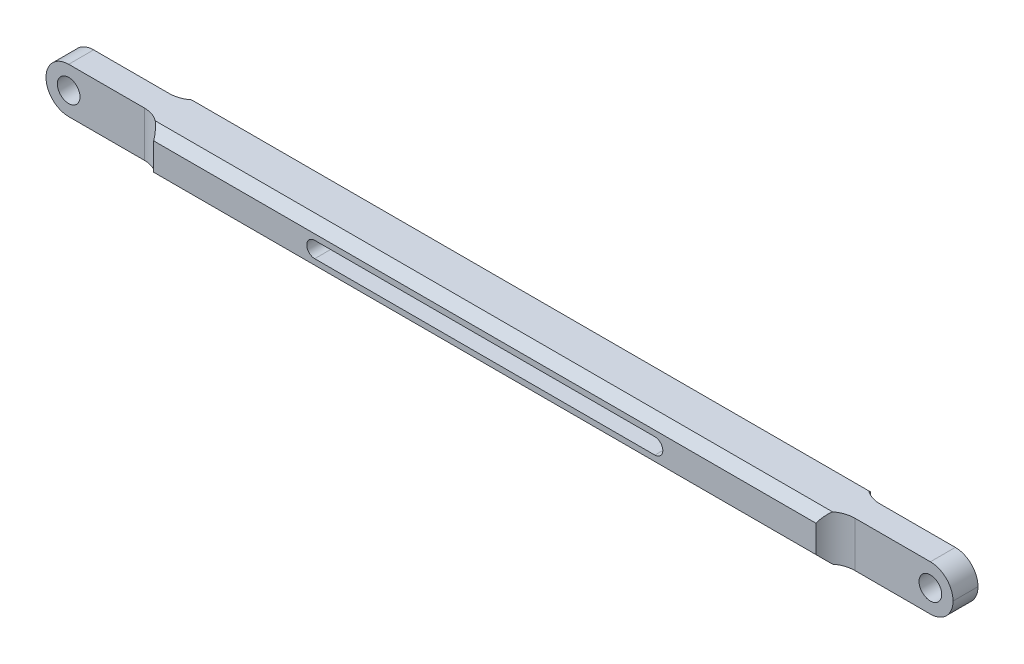
ISO-10303-21;
HEADER;
FILE_DESCRIPTION(('STEP AP214'),'2;1');
FILE_NAME('part.step','',(''),(''),'','','');
FILE_SCHEMA(('AUTOMOTIVE_DESIGN { 1 0 10303 214 1 1 1 1 }'));
ENDSEC;
DATA;
#1=APPLICATION_CONTEXT('core data for automotive mechanical design processes');
#2=APPLICATION_PROTOCOL_DEFINITION('international standard','automotive_design',2000,#1);
#3=PRODUCT_CONTEXT('',#1,'mechanical');
#4=PRODUCT('Part','Part','',(#3));
#5=PRODUCT_RELATED_PRODUCT_CATEGORY('part','',(#4));
#6=PRODUCT_DEFINITION_FORMATION('','',#4);
#7=PRODUCT_DEFINITION_CONTEXT('part definition',#1,'design');
#8=PRODUCT_DEFINITION('design','',#6,#7);
#9=PRODUCT_DEFINITION_SHAPE('','',#8);
#10=(LENGTH_UNIT() NAMED_UNIT(*) SI_UNIT(.MILLI.,.METRE.));
#11=(NAMED_UNIT(*) PLANE_ANGLE_UNIT() SI_UNIT($,.RADIAN.));
#12=(NAMED_UNIT(*) SI_UNIT($,.STERADIAN.) SOLID_ANGLE_UNIT());
#13=UNCERTAINTY_MEASURE_WITH_UNIT(LENGTH_MEASURE(1.E-05),#10,'distance_accuracy_value','');
#14=(GEOMETRIC_REPRESENTATION_CONTEXT(3) GLOBAL_UNCERTAINTY_ASSIGNED_CONTEXT((#13)) GLOBAL_UNIT_ASSIGNED_CONTEXT((#10,
#11,#12)) REPRESENTATION_CONTEXT('',''));
#15=CARTESIAN_POINT('',(0.,0.,0.));
#16=DIRECTION('',(0.,0.,1.));
#17=DIRECTION('',(1.,0.,0.));
#18=AXIS2_PLACEMENT_3D('',#15,#16,#17);
#19=CARTESIAN_POINT('',(-100.,5.,6.));
#20=DIRECTION('',(0.,-1.,0.));
#21=DIRECTION('',(0.,0.,-1.));
#22=AXIS2_PLACEMENT_3D('',#19,#20,#21);
#23=PLANE('',#22);
#24=CARTESIAN_POINT('',(-78.3326822519254,5.,8.75));
#25=DIRECTION('',(0.,-1.,0.));
#26=DIRECTION('',(0.,0.,-1.));
#27=AXIS2_PLACEMENT_3D('',#24,#25,#26);
#28=CIRCLE('',#27,6.);
#29=CARTESIAN_POINT('',(-78.3326822519254,5.,2.75));
#30=VERTEX_POINT('',#29);
#31=CARTESIAN_POINT('',(-74.6669626772716,5.,4.));
#32=VERTEX_POINT('',#31);
#33=EDGE_CURVE('E283',#30,#32,#28,.T.);
#34=ORIENTED_EDGE('',*,*,#33,.T.);
#35=DIRECTION('',(1.,0.,0.));
#36=VECTOR('',#35,1.);
#37=CARTESIAN_POINT('',(73.,5.,4.));
#38=LINE('',#37,#36);
#39=CARTESIAN_POINT('',(74.6669626772716,5.,4.));
#40=VERTEX_POINT('',#39);
#41=EDGE_CURVE('E331',#32,#40,#38,.T.);
#42=ORIENTED_EDGE('',*,*,#41,.T.);
#43=CARTESIAN_POINT('',(78.3326822519254,5.,8.75));
#44=DIRECTION('',(0.,-1.,0.));
#45=DIRECTION('',(0.,0.,-1.));
#46=AXIS2_PLACEMENT_3D('',#43,#44,#45);
#47=CIRCLE('',#46,6.);
#48=CARTESIAN_POINT('',(78.3326822519254,5.,2.75));
#49=VERTEX_POINT('',#48);
#50=EDGE_CURVE('E273',#40,#49,#47,.T.);
#51=ORIENTED_EDGE('',*,*,#50,.T.);
#52=DIRECTION('',(1.,0.,0.));
#53=VECTOR('',#52,1.);
#54=CARTESIAN_POINT('',(-100.,5.,2.75));
#55=LINE('',#54,#53);
#56=CARTESIAN_POINT('',(95.,5.,2.75));
#57=VERTEX_POINT('',#56);
#58=EDGE_CURVE('E225',#49,#57,#55,.T.);
#59=ORIENTED_EDGE('',*,*,#58,.T.);
#60=DIRECTION('',(0.,0.,-1.));
#61=VECTOR('',#60,1.);
#62=CARTESIAN_POINT('',(95.,5.,6.));
#63=LINE('',#62,#61);
#64=CARTESIAN_POINT('',(95.,5.,-2.75));
#65=VERTEX_POINT('',#64);
#66=EDGE_CURVE('E302',#57,#65,#63,.T.);
#67=ORIENTED_EDGE('',*,*,#66,.T.);
#68=DIRECTION('',(-1.,0.,0.));
#69=VECTOR('',#68,1.);
#70=CARTESIAN_POINT('',(-100.,5.,-2.75));
#71=LINE('',#70,#69);
#72=CARTESIAN_POINT('',(78.3326822519254,5.,-2.75));
#73=VERTEX_POINT('',#72);
#74=EDGE_CURVE('E223',#65,#73,#71,.T.);
#75=ORIENTED_EDGE('',*,*,#74,.T.);
#76=CARTESIAN_POINT('',(78.3326822519254,5.,-8.75));
#77=DIRECTION('',(0.,-1.,0.));
#78=DIRECTION('',(0.,0.,-1.));
#79=AXIS2_PLACEMENT_3D('',#76,#77,#78);
#80=CIRCLE('',#79,6.);
#81=CARTESIAN_POINT('',(74.6669626772716,5.,-4.));
#82=VERTEX_POINT('',#81);
#83=EDGE_CURVE('E268',#73,#82,#80,.T.);
#84=ORIENTED_EDGE('',*,*,#83,.T.);
#85=DIRECTION('',(-1.,0.,0.));
#86=VECTOR('',#85,1.);
#87=CARTESIAN_POINT('',(-100.,5.,-4.));
#88=LINE('',#87,#86);
#89=CARTESIAN_POINT('',(-74.6669626772716,5.,-4.));
#90=VERTEX_POINT('',#89);
#91=EDGE_CURVE('E328',#82,#90,#88,.T.);
#92=ORIENTED_EDGE('',*,*,#91,.T.);
#93=CARTESIAN_POINT('',(-78.3326822519254,5.,-8.75));
#94=DIRECTION('',(0.,-1.,0.));
#95=DIRECTION('',(0.,0.,-1.));
#96=AXIS2_PLACEMENT_3D('',#93,#94,#95);
#97=CIRCLE('',#96,6.);
#98=CARTESIAN_POINT('',(-78.3326822519254,5.,-2.75));
#99=VERTEX_POINT('',#98);
#100=EDGE_CURVE('E278',#90,#99,#97,.T.);
#101=ORIENTED_EDGE('',*,*,#100,.T.);
#102=DIRECTION('',(-1.,0.,0.));
#103=VECTOR('',#102,1.);
#104=CARTESIAN_POINT('',(-100.,5.,-2.75));
#105=LINE('',#104,#103);
#106=CARTESIAN_POINT('',(-95.,5.,-2.75));
#107=VERTEX_POINT('',#106);
#108=EDGE_CURVE('E231',#99,#107,#105,.T.);
#109=ORIENTED_EDGE('',*,*,#108,.T.);
#110=DIRECTION('',(0.,0.,-1.));
#111=VECTOR('',#110,1.);
#112=CARTESIAN_POINT('',(-95.,5.,6.));
#113=LINE('',#112,#111);
#114=CARTESIAN_POINT('',(-95.,5.,2.75));
#115=VERTEX_POINT('',#114);
#116=EDGE_CURVE('E304',#107,#115,#113,.F.);
#117=ORIENTED_EDGE('',*,*,#116,.T.);
#118=DIRECTION('',(1.,0.,0.));
#119=VECTOR('',#118,1.);
#120=CARTESIAN_POINT('',(-100.,5.,2.75));
#121=LINE('',#120,#119);
#122=EDGE_CURVE('E229',#115,#30,#121,.T.);
#123=ORIENTED_EDGE('',*,*,#122,.T.);
#124=EDGE_LOOP('',(#34,#42,#51,#59,#67,#75,#84,#92,#101,#109,#117,#123));
#125=FACE_BOUND('',#124,.T.);
#126=ADVANCED_FACE('F37',(#125),#23,.F.);
#127=CARTESIAN_POINT('',(-100.,-5.,6.));
#128=DIRECTION('',(0.,1.,0.));
#129=DIRECTION('',(0.,0.,1.));
#130=AXIS2_PLACEMENT_3D('',#127,#128,#129);
#131=PLANE('',#130);
#132=CARTESIAN_POINT('',(78.3326822519254,-5.,8.75));
#133=DIRECTION('',(0.,1.,0.));
#134=DIRECTION('',(0.,0.,1.));
#135=AXIS2_PLACEMENT_3D('',#132,#133,#134);
#136=CIRCLE('',#135,6.);
#137=CARTESIAN_POINT('',(78.3326822519254,-5.,2.75));
#138=VERTEX_POINT('',#137);
#139=CARTESIAN_POINT('',(74.6669626772716,-5.,4.));
#140=VERTEX_POINT('',#139);
#141=EDGE_CURVE('E275',#138,#140,#136,.T.);
#142=ORIENTED_EDGE('',*,*,#141,.T.);
#143=DIRECTION('',(-1.,0.,0.));
#144=VECTOR('',#143,1.);
#145=CARTESIAN_POINT('',(-73.,-5.,4.));
#146=LINE('',#145,#144);
#147=CARTESIAN_POINT('',(-74.6669626772716,-5.,4.));
#148=VERTEX_POINT('',#147);
#149=EDGE_CURVE('E340',#140,#148,#146,.T.);
#150=ORIENTED_EDGE('',*,*,#149,.T.);
#151=CARTESIAN_POINT('',(-78.3326822519254,-5.,8.75));
#152=DIRECTION('',(0.,1.,0.));
#153=DIRECTION('',(0.,0.,1.));
#154=AXIS2_PLACEMENT_3D('',#151,#152,#153);
#155=CIRCLE('',#154,6.);
#156=CARTESIAN_POINT('',(-78.3326822519254,-5.,2.75));
#157=VERTEX_POINT('',#156);
#158=EDGE_CURVE('E286',#148,#157,#155,.T.);
#159=ORIENTED_EDGE('',*,*,#158,.T.);
#160=DIRECTION('',(-1.,0.,0.));
#161=VECTOR('',#160,1.);
#162=CARTESIAN_POINT('',(-100.,-5.,2.75));
#163=LINE('',#162,#161);
#164=CARTESIAN_POINT('',(-95.,-5.,2.75));
#165=VERTEX_POINT('',#164);
#166=EDGE_CURVE('E251',#157,#165,#163,.T.);
#167=ORIENTED_EDGE('',*,*,#166,.T.);
#168=DIRECTION('',(0.,0.,-1.));
#169=VECTOR('',#168,1.);
#170=CARTESIAN_POINT('',(-95.,-5.,6.));
#171=LINE('',#170,#169);
#172=CARTESIAN_POINT('',(-95.,-5.,-2.75));
#173=VERTEX_POINT('',#172);
#174=EDGE_CURVE('E291',#165,#173,#171,.T.);
#175=ORIENTED_EDGE('',*,*,#174,.T.);
#176=DIRECTION('',(1.,0.,0.));
#177=VECTOR('',#176,1.);
#178=CARTESIAN_POINT('',(-100.,-5.,-2.75));
#179=LINE('',#178,#177);
#180=CARTESIAN_POINT('',(-78.3326822519254,-5.,-2.75));
#181=VERTEX_POINT('',#180);
#182=EDGE_CURVE('E254',#173,#181,#179,.T.);
#183=ORIENTED_EDGE('',*,*,#182,.T.);
#184=CARTESIAN_POINT('',(-78.3326822519254,-5.,-8.75));
#185=DIRECTION('',(0.,1.,0.));
#186=DIRECTION('',(0.,0.,1.));
#187=AXIS2_PLACEMENT_3D('',#184,#185,#186);
#188=CIRCLE('',#187,6.);
#189=CARTESIAN_POINT('',(-74.6669626772716,-5.,-4.));
#190=VERTEX_POINT('',#189);
#191=EDGE_CURVE('E280',#181,#190,#188,.T.);
#192=ORIENTED_EDGE('',*,*,#191,.T.);
#193=DIRECTION('',(1.,0.,0.));
#194=VECTOR('',#193,1.);
#195=CARTESIAN_POINT('',(-100.,-5.,-4.));
#196=LINE('',#195,#194);
#197=CARTESIAN_POINT('',(74.6669626772716,-5.,-4.));
#198=VERTEX_POINT('',#197);
#199=EDGE_CURVE('E337',#190,#198,#196,.T.);
#200=ORIENTED_EDGE('',*,*,#199,.T.);
#201=CARTESIAN_POINT('',(78.3326822519254,-5.,-8.75));
#202=DIRECTION('',(0.,1.,0.));
#203=DIRECTION('',(0.,0.,1.));
#204=AXIS2_PLACEMENT_3D('',#201,#202,#203);
#205=CIRCLE('',#204,6.);
#206=CARTESIAN_POINT('',(78.3326822519254,-5.,-2.75));
#207=VERTEX_POINT('',#206);
#208=EDGE_CURVE('E271',#198,#207,#205,.T.);
#209=ORIENTED_EDGE('',*,*,#208,.T.);
#210=DIRECTION('',(1.,0.,0.));
#211=VECTOR('',#210,1.);
#212=CARTESIAN_POINT('',(-100.,-5.,-2.75));
#213=LINE('',#212,#211);
#214=CARTESIAN_POINT('',(95.,-5.,-2.75));
#215=VERTEX_POINT('',#214);
#216=EDGE_CURVE('E246',#207,#215,#213,.T.);
#217=ORIENTED_EDGE('',*,*,#216,.T.);
#218=DIRECTION('',(0.,0.,-1.));
#219=VECTOR('',#218,1.);
#220=CARTESIAN_POINT('',(95.,-5.,6.));
#221=LINE('',#220,#219);
#222=CARTESIAN_POINT('',(95.,-5.,2.75));
#223=VERTEX_POINT('',#222);
#224=EDGE_CURVE('E288',#215,#223,#221,.F.);
#225=ORIENTED_EDGE('',*,*,#224,.T.);
#226=DIRECTION('',(-1.,0.,0.));
#227=VECTOR('',#226,1.);
#228=CARTESIAN_POINT('',(-100.,-5.,2.75));
#229=LINE('',#228,#227);
#230=EDGE_CURVE('E249',#223,#138,#229,.T.);
#231=ORIENTED_EDGE('',*,*,#230,.T.);
#232=EDGE_LOOP('',(#142,#150,#159,#167,#175,#183,#192,#200,#209,#217,#225,#231));
#233=FACE_BOUND('',#232,.T.);
#234=ADVANCED_FACE('F387',(#233),#131,.F.);
#235=CARTESIAN_POINT('',(0.,0.,6.));
#236=DIRECTION('',(0.,0.,1.));
#237=DIRECTION('',(1.,0.,0.));
#238=AXIS2_PLACEMENT_3D('',#235,#236,#237);
#239=PLANE('',#238);
#240=CARTESIAN_POINT('',(37.5,0.,6.));
#241=DIRECTION('',(0.,0.,1.));
#242=DIRECTION('',(1.,0.,0.));
#243=AXIS2_PLACEMENT_3D('',#240,#241,#242);
#244=CIRCLE('',#243,1.75);
#245=CARTESIAN_POINT('',(37.5,-1.75,6.));
#246=VERTEX_POINT('',#245);
#247=CARTESIAN_POINT('',(37.5,1.75,6.));
#248=VERTEX_POINT('',#247);
#249=EDGE_CURVE('E220',#246,#248,#244,.T.);
#250=ORIENTED_EDGE('',*,*,#249,.F.);
#251=DIRECTION('',(1.,0.,0.));
#252=VECTOR('',#251,1.);
#253=CARTESIAN_POINT('',(0.,-1.74999999999999,6.));
#254=LINE('',#253,#252);
#255=CARTESIAN_POINT('',(-37.5,-1.74999999999999,6.));
#256=VERTEX_POINT('',#255);
#257=EDGE_CURVE('E213',#256,#246,#254,.T.);
#258=ORIENTED_EDGE('',*,*,#257,.F.);
#259=CARTESIAN_POINT('',(-37.5,0.,6.));
#260=DIRECTION('',(0.,0.,1.));
#261=DIRECTION('',(1.,0.,0.));
#262=AXIS2_PLACEMENT_3D('',#259,#260,#261);
#263=CIRCLE('',#262,1.75);
#264=CARTESIAN_POINT('',(-37.5,1.75000000000001,6.));
#265=VERTEX_POINT('',#264);
#266=EDGE_CURVE('E193',#265,#256,#263,.T.);
#267=ORIENTED_EDGE('',*,*,#266,.F.);
#268=DIRECTION('',(-1.,0.,0.));
#269=VECTOR('',#268,1.);
#270=CARTESIAN_POINT('',(0.,1.75000000000001,6.));
#271=LINE('',#270,#269);
#272=EDGE_CURVE('E218',#248,#265,#271,.T.);
#273=ORIENTED_EDGE('',*,*,#272,.F.);
#274=EDGE_LOOP('',(#250,#258,#267,#273));
#275=FACE_BOUND('',#274,.T.);
#276=DIRECTION('',(0.,-1.,0.));
#277=VECTOR('',#276,1.);
#278=CARTESIAN_POINT('',(73.,0.,6.));
#279=LINE('',#278,#277);
#280=CARTESIAN_POINT('',(73.,3.,6.));
#281=VERTEX_POINT('',#280);
#282=CARTESIAN_POINT('',(73.,-3.,6.));
#283=VERTEX_POINT('',#282);
#284=EDGE_CURVE('E240',#281,#283,#279,.T.);
#285=ORIENTED_EDGE('',*,*,#284,.F.);
#286=DIRECTION('',(-1.,0.,0.));
#287=VECTOR('',#286,1.);
#288=CARTESIAN_POINT('',(-73.,3.,6.));
#289=LINE('',#288,#287);
#290=CARTESIAN_POINT('',(-73.,3.,6.));
#291=VERTEX_POINT('',#290);
#292=EDGE_CURVE('E321',#281,#291,#289,.T.);
#293=ORIENTED_EDGE('',*,*,#292,.T.);
#294=DIRECTION('',(0.,1.,0.));
#295=VECTOR('',#294,1.);
#296=CARTESIAN_POINT('',(-73.,0.,6.));
#297=LINE('',#296,#295);
#298=CARTESIAN_POINT('',(-73.,-3.,6.));
#299=VERTEX_POINT('',#298);
#300=EDGE_CURVE('E243',#299,#291,#297,.T.);
#301=ORIENTED_EDGE('',*,*,#300,.F.);
#302=DIRECTION('',(1.,0.,0.));
#303=VECTOR('',#302,1.);
#304=CARTESIAN_POINT('',(73.,-3.,6.));
#305=LINE('',#304,#303);
#306=EDGE_CURVE('E314',#299,#283,#305,.T.);
#307=ORIENTED_EDGE('',*,*,#306,.T.);
#308=EDGE_LOOP('',(#285,#293,#301,#307));
#309=FACE_BOUND('',#308,.T.);
#310=ADVANCED_FACE('F408',(#275,#309),#239,.T.);
#311=CARTESIAN_POINT('',(0.,0.,-6.));
#312=DIRECTION('',(0.,0.,1.));
#313=DIRECTION('',(1.,0.,0.));
#314=AXIS2_PLACEMENT_3D('',#311,#312,#313);
#315=PLANE('',#314);
#316=DIRECTION('',(-1.,0.,0.));
#317=VECTOR('',#316,1.);
#318=CARTESIAN_POINT('',(37.5,-1.75,-6.));
#319=LINE('',#318,#317);
#320=CARTESIAN_POINT('',(37.5,-1.75,-6.));
#321=VERTEX_POINT('',#320);
#322=CARTESIAN_POINT('',(-37.5,-1.74999999999999,-6.));
#323=VERTEX_POINT('',#322);
#324=EDGE_CURVE('E199',#321,#323,#319,.T.);
#325=ORIENTED_EDGE('',*,*,#324,.F.);
#326=CARTESIAN_POINT('',(37.5,0.,-6.));
#327=DIRECTION('',(0.,0.,-1.));
#328=DIRECTION('',(-1.,0.,0.));
#329=AXIS2_PLACEMENT_3D('',#326,#327,#328);
#330=CIRCLE('',#329,1.75);
#331=CARTESIAN_POINT('',(37.5,1.75,-6.));
#332=VERTEX_POINT('',#331);
#333=EDGE_CURVE('E62',#332,#321,#330,.T.);
#334=ORIENTED_EDGE('',*,*,#333,.F.);
#335=DIRECTION('',(1.,0.,0.));
#336=VECTOR('',#335,1.);
#337=CARTESIAN_POINT('',(37.5,1.75,-6.));
#338=LINE('',#337,#336);
#339=CARTESIAN_POINT('',(-37.5,1.75000000000001,-6.));
#340=VERTEX_POINT('',#339);
#341=EDGE_CURVE('E206',#340,#332,#338,.T.);
#342=ORIENTED_EDGE('',*,*,#341,.F.);
#343=CARTESIAN_POINT('',(-37.5,0.,-6.));
#344=DIRECTION('',(0.,0.,-1.));
#345=DIRECTION('',(-1.,0.,0.));
#346=AXIS2_PLACEMENT_3D('',#343,#344,#345);
#347=CIRCLE('',#346,1.75);
#348=EDGE_CURVE('E190',#323,#340,#347,.T.);
#349=ORIENTED_EDGE('',*,*,#348,.F.);
#350=EDGE_LOOP('',(#325,#334,#342,#349));
#351=FACE_BOUND('',#350,.T.);
#352=DIRECTION('',(0.,1.,0.));
#353=VECTOR('',#352,1.);
#354=CARTESIAN_POINT('',(-73.,0.,-6.));
#355=LINE('',#354,#353);
#356=CARTESIAN_POINT('',(-73.,-3.,-6.));
#357=VERTEX_POINT('',#356);
#358=CARTESIAN_POINT('',(-73.,3.,-6.));
#359=VERTEX_POINT('',#358);
#360=EDGE_CURVE('E237',#357,#359,#355,.T.);
#361=ORIENTED_EDGE('',*,*,#360,.T.);
#362=DIRECTION('',(1.,0.,0.));
#363=VECTOR('',#362,1.);
#364=CARTESIAN_POINT('',(0.,3.,-6.));
#365=LINE('',#364,#363);
#366=CARTESIAN_POINT('',(73.,3.,-6.));
#367=VERTEX_POINT('',#366);
#368=EDGE_CURVE('E348',#359,#367,#365,.T.);
#369=ORIENTED_EDGE('',*,*,#368,.T.);
#370=DIRECTION('',(0.,-1.,0.));
#371=VECTOR('',#370,1.);
#372=CARTESIAN_POINT('',(73.,0.,-6.));
#373=LINE('',#372,#371);
#374=CARTESIAN_POINT('',(73.,-3.,-6.));
#375=VERTEX_POINT('',#374);
#376=EDGE_CURVE('E234',#367,#375,#373,.T.);
#377=ORIENTED_EDGE('',*,*,#376,.T.);
#378=DIRECTION('',(-1.,0.,0.));
#379=VECTOR('',#378,1.);
#380=CARTESIAN_POINT('',(0.,-3.,-6.));
#381=LINE('',#380,#379);
#382=EDGE_CURVE('E346',#375,#357,#381,.T.);
#383=ORIENTED_EDGE('',*,*,#382,.T.);
#384=EDGE_LOOP('',(#361,#369,#377,#383));
#385=FACE_BOUND('',#384,.T.);
#386=ADVANCED_FACE('F203',(#351,#385),#315,.F.);
#387=CARTESIAN_POINT('',(127.,-15.5,-2.75));
#388=DIRECTION('',(0.,0.,1.));
#389=DIRECTION('',(1.,0.,0.));
#390=AXIS2_PLACEMENT_3D('',#387,#388,#389);
#391=PLANE('',#390);
#392=CARTESIAN_POINT('',(95.,0.,-2.75));
#393=DIRECTION('',(0.,0.,-1.));
#394=DIRECTION('',(-1.,0.,0.));
#395=AXIS2_PLACEMENT_3D('',#392,#393,#394);
#396=CIRCLE('',#395,2.50000000000001);
#397=CARTESIAN_POINT('',(92.5,0.,-2.75));
#398=VERTEX_POINT('',#397);
#399=EDGE_CURVE('E357',#398,#398,#396,.T.);
#400=ORIENTED_EDGE('',*,*,#399,.F.);
#401=EDGE_LOOP('',(#400));
#402=FACE_BOUND('',#401,.T.);
#403=CARTESIAN_POINT('',(95.,0.,-2.75));
#404=DIRECTION('',(0.,0.,1.));
#405=DIRECTION('',(1.,0.,0.));
#406=AXIS2_PLACEMENT_3D('',#403,#404,#405);
#407=CIRCLE('',#406,5.);
#408=CARTESIAN_POINT('',(100.,0.,-2.75));
#409=VERTEX_POINT('',#408);
#410=EDGE_CURVE('E306',#65,#409,#407,.F.);
#411=ORIENTED_EDGE('',*,*,#410,.T.);
#412=CARTESIAN_POINT('',(95.,0.,-2.75));
#413=DIRECTION('',(0.,0.,1.));
#414=DIRECTION('',(1.,0.,0.));
#415=AXIS2_PLACEMENT_3D('',#412,#413,#414);
#416=CIRCLE('',#415,5.);
#417=EDGE_CURVE('E308',#409,#215,#416,.F.);
#418=ORIENTED_EDGE('',*,*,#417,.T.);
#419=ORIENTED_EDGE('',*,*,#216,.F.);
#420=DIRECTION('',(0.,1.,0.));
#421=VECTOR('',#420,1.);
#422=CARTESIAN_POINT('',(78.3326822519254,-15.5,-2.75));
#423=LINE('',#422,#421);
#424=EDGE_CURVE('E256',#207,#73,#423,.T.);
#425=ORIENTED_EDGE('',*,*,#424,.T.);
#426=ORIENTED_EDGE('',*,*,#74,.F.);
#427=EDGE_LOOP('',(#411,#418,#419,#425,#426));
#428=FACE_BOUND('',#427,.T.);
#429=ADVANCED_FACE('F368',(#402,#428),#391,.F.);
#430=CARTESIAN_POINT('',(-127.,-15.5,-2.75));
#431=DIRECTION('',(0.,0.,1.));
#432=DIRECTION('',(1.,0.,0.));
#433=AXIS2_PLACEMENT_3D('',#430,#431,#432);
#434=PLANE('',#433);
#435=CARTESIAN_POINT('',(-95.,0.,-2.75));
#436=DIRECTION('',(0.,0.,-1.));
#437=DIRECTION('',(-1.,0.,0.));
#438=AXIS2_PLACEMENT_3D('',#435,#436,#437);
#439=CIRCLE('',#438,2.5);
#440=CARTESIAN_POINT('',(-97.5,0.,-2.75));
#441=VERTEX_POINT('',#440);
#442=EDGE_CURVE('E352',#441,#441,#439,.T.);
#443=ORIENTED_EDGE('',*,*,#442,.F.);
#444=EDGE_LOOP('',(#443));
#445=FACE_BOUND('',#444,.T.);
#446=ORIENTED_EDGE('',*,*,#182,.F.);
#447=CARTESIAN_POINT('',(-95.,0.,-2.75));
#448=DIRECTION('',(0.,0.,1.));
#449=DIRECTION('',(1.,0.,0.));
#450=AXIS2_PLACEMENT_3D('',#447,#448,#449);
#451=CIRCLE('',#450,5.);
#452=CARTESIAN_POINT('',(-100.,0.,-2.75));
#453=VERTEX_POINT('',#452);
#454=EDGE_CURVE('E296',#173,#453,#451,.F.);
#455=ORIENTED_EDGE('',*,*,#454,.T.);
#456=CARTESIAN_POINT('',(-95.,0.,-2.75));
#457=DIRECTION('',(0.,0.,1.));
#458=DIRECTION('',(1.,0.,0.));
#459=AXIS2_PLACEMENT_3D('',#456,#457,#458);
#460=CIRCLE('',#459,5.);
#461=EDGE_CURVE('E294',#453,#107,#460,.F.);
#462=ORIENTED_EDGE('',*,*,#461,.T.);
#463=ORIENTED_EDGE('',*,*,#108,.F.);
#464=DIRECTION('',(0.,-1.,0.));
#465=VECTOR('',#464,1.);
#466=CARTESIAN_POINT('',(-78.3326822519254,-15.5,-2.75));
#467=LINE('',#466,#465);
#468=EDGE_CURVE('E262',#99,#181,#467,.T.);
#469=ORIENTED_EDGE('',*,*,#468,.T.);
#470=EDGE_LOOP('',(#446,#455,#462,#463,#469));
#471=FACE_BOUND('',#470,.T.);
#472=ADVANCED_FACE('F371',(#445,#471),#434,.F.);
#473=CARTESIAN_POINT('',(127.,-15.5,2.75));
#474=DIRECTION('',(0.,0.,-1.));
#475=DIRECTION('',(-1.,0.,0.));
#476=AXIS2_PLACEMENT_3D('',#473,#474,#475);
#477=PLANE('',#476);
#478=CARTESIAN_POINT('',(95.,0.,2.75));
#479=DIRECTION('',(0.,0.,-1.));
#480=DIRECTION('',(-1.,0.,0.));
#481=AXIS2_PLACEMENT_3D('',#478,#479,#480);
#482=CIRCLE('',#481,2.50000000000001);
#483=CARTESIAN_POINT('',(92.5,0.,2.75));
#484=VERTEX_POINT('',#483);
#485=EDGE_CURVE('E41',#484,#484,#482,.T.);
#486=ORIENTED_EDGE('',*,*,#485,.T.);
#487=EDGE_LOOP('',(#486));
#488=FACE_BOUND('',#487,.T.);
#489=ORIENTED_EDGE('',*,*,#230,.F.);
#490=CARTESIAN_POINT('',(95.,0.,2.75));
#491=DIRECTION('',(0.,0.,-1.));
#492=DIRECTION('',(-1.,0.,0.));
#493=AXIS2_PLACEMENT_3D('',#490,#491,#492);
#494=CIRCLE('',#493,5.);
#495=CARTESIAN_POINT('',(100.,0.,2.75));
#496=VERTEX_POINT('',#495);
#497=EDGE_CURVE('E312',#223,#496,#494,.F.);
#498=ORIENTED_EDGE('',*,*,#497,.T.);
#499=CARTESIAN_POINT('',(95.,0.,2.75));
#500=DIRECTION('',(0.,0.,-1.));
#501=DIRECTION('',(-1.,0.,0.));
#502=AXIS2_PLACEMENT_3D('',#499,#500,#501);
#503=CIRCLE('',#502,5.);
#504=EDGE_CURVE('E310',#496,#57,#503,.F.);
#505=ORIENTED_EDGE('',*,*,#504,.T.);
#506=ORIENTED_EDGE('',*,*,#58,.F.);
#507=DIRECTION('',(0.,1.,0.));
#508=VECTOR('',#507,1.);
#509=CARTESIAN_POINT('',(78.3326822519254,-15.5,2.75));
#510=LINE('',#509,#508);
#511=EDGE_CURVE('E259',#49,#138,#510,.F.);
#512=ORIENTED_EDGE('',*,*,#511,.T.);
#513=EDGE_LOOP('',(#489,#498,#505,#506,#512));
#514=FACE_BOUND('',#513,.T.);
#515=ADVANCED_FACE('F389',(#488,#514),#477,.F.);
#516=CARTESIAN_POINT('',(-127.,-15.5,2.75));
#517=DIRECTION('',(0.,0.,-1.));
#518=DIRECTION('',(-1.,0.,0.));
#519=AXIS2_PLACEMENT_3D('',#516,#517,#518);
#520=PLANE('',#519);
#521=CARTESIAN_POINT('',(-95.,0.,2.75));
#522=DIRECTION('',(0.,0.,-1.));
#523=DIRECTION('',(-1.,0.,0.));
#524=AXIS2_PLACEMENT_3D('',#521,#522,#523);
#525=CIRCLE('',#524,2.5);
#526=CARTESIAN_POINT('',(-97.5,0.,2.75));
#527=VERTEX_POINT('',#526);
#528=EDGE_CURVE('E350',#527,#527,#525,.T.);
#529=ORIENTED_EDGE('',*,*,#528,.T.);
#530=EDGE_LOOP('',(#529));
#531=FACE_BOUND('',#530,.T.);
#532=CARTESIAN_POINT('',(-95.,0.,2.75));
#533=DIRECTION('',(0.,0.,-1.));
#534=DIRECTION('',(-1.,0.,0.));
#535=AXIS2_PLACEMENT_3D('',#532,#533,#534);
#536=CIRCLE('',#535,5.);
#537=CARTESIAN_POINT('',(-100.,0.,2.75));
#538=VERTEX_POINT('',#537);
#539=EDGE_CURVE('E298',#115,#538,#536,.F.);
#540=ORIENTED_EDGE('',*,*,#539,.T.);
#541=CARTESIAN_POINT('',(-95.,0.,2.75));
#542=DIRECTION('',(0.,0.,-1.));
#543=DIRECTION('',(-1.,0.,0.));
#544=AXIS2_PLACEMENT_3D('',#541,#542,#543);
#545=CIRCLE('',#544,5.);
#546=EDGE_CURVE('E300',#538,#165,#545,.F.);
#547=ORIENTED_EDGE('',*,*,#546,.T.);
#548=ORIENTED_EDGE('',*,*,#166,.F.);
#549=DIRECTION('',(0.,-1.,0.));
#550=VECTOR('',#549,1.);
#551=CARTESIAN_POINT('',(-78.3326822519254,-15.5,2.75));
#552=LINE('',#551,#550);
#553=EDGE_CURVE('E265',#157,#30,#552,.F.);
#554=ORIENTED_EDGE('',*,*,#553,.T.);
#555=ORIENTED_EDGE('',*,*,#122,.F.);
#556=EDGE_LOOP('',(#540,#547,#548,#554,#555));
#557=FACE_BOUND('',#556,.T.);
#558=ADVANCED_FACE('F420',(#531,#557),#520,.F.);
#559=CARTESIAN_POINT('',(78.3326822519254,-15.5,-8.75));
#560=DIRECTION('',(0.,1.,0.));
#561=DIRECTION('',(0.,0.,1.));
#562=AXIS2_PLACEMENT_3D('',#559,#560,#561);
#563=CYLINDRICAL_SURFACE('',#562,6.);
#564=ORIENTED_EDGE('',*,*,#376,.F.);
#565=CARTESIAN_POINT('',(78.3326822519254,0.249999999999997,-8.75));
#566=DIRECTION('',(0.,-0.707106781186547,0.707106781186547));
#567=DIRECTION('',(0.,0.707106781186548,0.707106781186548));
#568=AXIS2_PLACEMENT_3D('',#565,#566,#567);
#569=ELLIPSE('',#568,8.48528137423857,6.);
#570=EDGE_CURVE('E11',#367,#82,#569,.F.);
#571=ORIENTED_EDGE('',*,*,#570,.T.);
#572=ORIENTED_EDGE('',*,*,#83,.F.);
#573=ORIENTED_EDGE('',*,*,#424,.F.);
#574=ORIENTED_EDGE('',*,*,#208,.F.);
#575=CARTESIAN_POINT('',(78.3326822519254,-0.249999999999999,-8.75));
#576=DIRECTION('',(0.,0.707106781186547,0.707106781186547));
#577=DIRECTION('',(0.,0.707106781186548,-0.707106781186548));
#578=AXIS2_PLACEMENT_3D('',#575,#576,#577);
#579=ELLIPSE('',#578,8.48528137423857,6.);
#580=EDGE_CURVE('E46',#198,#375,#579,.F.);
#581=ORIENTED_EDGE('',*,*,#580,.T.);
#582=EDGE_LOOP('',(#564,#571,#572,#573,#574,#581));
#583=FACE_BOUND('',#582,.T.);
#584=ADVANCED_FACE('F446',(#583),#563,.F.);
#585=CARTESIAN_POINT('',(78.3326822519254,-15.5,8.75));
#586=DIRECTION('',(0.,1.,0.));
#587=DIRECTION('',(0.,0.,1.));
#588=AXIS2_PLACEMENT_3D('',#585,#586,#587);
#589=CYLINDRICAL_SURFACE('',#588,6.);
#590=ORIENTED_EDGE('',*,*,#50,.F.);
#591=CARTESIAN_POINT('',(78.3326822519254,0.25,8.75));
#592=DIRECTION('',(0.,0.707106781186547,0.707106781186547));
#593=DIRECTION('',(0.,0.707106781186548,-0.707106781186548));
#594=AXIS2_PLACEMENT_3D('',#591,#592,#593);
#595=ELLIPSE('',#594,8.48528137423857,6.);
#596=EDGE_CURVE('E335',#40,#281,#595,.T.);
#597=ORIENTED_EDGE('',*,*,#596,.T.);
#598=ORIENTED_EDGE('',*,*,#284,.T.);
#599=CARTESIAN_POINT('',(78.3326822519254,-0.249999999999999,8.75));
#600=DIRECTION('',(0.,-0.707106781186547,0.707106781186547));
#601=DIRECTION('',(0.,0.707106781186548,0.707106781186548));
#602=AXIS2_PLACEMENT_3D('',#599,#600,#601);
#603=ELLIPSE('',#602,8.48528137423857,6.);
#604=EDGE_CURVE('E333',#283,#140,#603,.T.);
#605=ORIENTED_EDGE('',*,*,#604,.T.);
#606=ORIENTED_EDGE('',*,*,#141,.F.);
#607=ORIENTED_EDGE('',*,*,#511,.F.);
#608=EDGE_LOOP('',(#590,#597,#598,#605,#606,#607));
#609=FACE_BOUND('',#608,.T.);
#610=ADVANCED_FACE('F395',(#609),#589,.F.);
#611=CARTESIAN_POINT('',(-78.3326822519254,-15.5,-8.75));
#612=DIRECTION('',(0.,-1.,0.));
#613=DIRECTION('',(0.,0.,-1.));
#614=AXIS2_PLACEMENT_3D('',#611,#612,#613);
#615=CYLINDRICAL_SURFACE('',#614,6.);
#616=ORIENTED_EDGE('',*,*,#100,.F.);
#617=CARTESIAN_POINT('',(-78.3326822519254,0.249999999999997,-8.75));
#618=DIRECTION('',(0.,-0.707106781186547,0.707106781186547));
#619=DIRECTION('',(0.,-0.707106781186548,-0.707106781186548));
#620=AXIS2_PLACEMENT_3D('',#617,#618,#619);
#621=ELLIPSE('',#620,8.48528137423857,6.);
#622=EDGE_CURVE('E344',#90,#359,#621,.F.);
#623=ORIENTED_EDGE('',*,*,#622,.T.);
#624=ORIENTED_EDGE('',*,*,#360,.F.);
#625=CARTESIAN_POINT('',(-78.3326822519254,-0.249999999999999,-8.75));
#626=DIRECTION('',(0.,0.707106781186547,0.707106781186547));
#627=DIRECTION('',(0.,-0.707106781186548,0.707106781186548));
#628=AXIS2_PLACEMENT_3D('',#625,#626,#627);
#629=ELLIPSE('',#628,8.48528137423857,6.);
#630=EDGE_CURVE('E342',#357,#190,#629,.F.);
#631=ORIENTED_EDGE('',*,*,#630,.T.);
#632=ORIENTED_EDGE('',*,*,#191,.F.);
#633=ORIENTED_EDGE('',*,*,#468,.F.);
#634=EDGE_LOOP('',(#616,#623,#624,#631,#632,#633));
#635=FACE_BOUND('',#634,.T.);
#636=ADVANCED_FACE('F437',(#635),#615,.F.);
#637=CARTESIAN_POINT('',(-78.3326822519254,-15.5,8.75));
#638=DIRECTION('',(0.,-1.,0.));
#639=DIRECTION('',(0.,0.,-1.));
#640=AXIS2_PLACEMENT_3D('',#637,#638,#639);
#641=CYLINDRICAL_SURFACE('',#640,6.);
#642=ORIENTED_EDGE('',*,*,#300,.T.);
#643=CARTESIAN_POINT('',(-78.3326822519254,0.25,8.75));
#644=DIRECTION('',(0.,0.707106781186547,0.707106781186547));
#645=DIRECTION('',(0.,-0.707106781186548,0.707106781186548));
#646=AXIS2_PLACEMENT_3D('',#643,#644,#645);
#647=ELLIPSE('',#646,8.48528137423857,6.);
#648=EDGE_CURVE('E326',#291,#32,#647,.T.);
#649=ORIENTED_EDGE('',*,*,#648,.T.);
#650=ORIENTED_EDGE('',*,*,#33,.F.);
#651=ORIENTED_EDGE('',*,*,#553,.F.);
#652=ORIENTED_EDGE('',*,*,#158,.F.);
#653=CARTESIAN_POINT('',(-78.3326822519254,-0.249999999999999,8.75));
#654=DIRECTION('',(0.,-0.707106781186547,0.707106781186547));
#655=DIRECTION('',(0.,-0.707106781186548,-0.707106781186548));
#656=AXIS2_PLACEMENT_3D('',#653,#654,#655);
#657=ELLIPSE('',#656,8.48528137423857,6.);
#658=EDGE_CURVE('E324',#148,#299,#657,.T.);
#659=ORIENTED_EDGE('',*,*,#658,.T.);
#660=EDGE_LOOP('',(#642,#649,#650,#651,#652,#659));
#661=FACE_BOUND('',#660,.T.);
#662=ADVANCED_FACE('F404',(#661),#641,.F.);
#663=CARTESIAN_POINT('',(-95.,0.,6.));
#664=DIRECTION('',(0.,0.,-1.));
#665=DIRECTION('',(-1.,0.,0.));
#666=AXIS2_PLACEMENT_3D('',#663,#664,#665);
#667=CYLINDRICAL_SURFACE('',#666,5.);
#668=DIRECTION('',(0.,0.,-1.));
#669=VECTOR('',#668,1.);
#670=CARTESIAN_POINT('',(-100.,0.,6.));
#671=LINE('',#670,#669);
#672=EDGE_CURVE('E226',#538,#453,#671,.T.);
#673=ORIENTED_EDGE('',*,*,#672,.F.);
#674=ORIENTED_EDGE('',*,*,#539,.F.);
#675=ORIENTED_EDGE('',*,*,#116,.F.);
#676=ORIENTED_EDGE('',*,*,#461,.F.);
#677=EDGE_LOOP('',(#673,#674,#675,#676));
#678=FACE_BOUND('',#677,.T.);
#679=ADVANCED_FACE('F424',(#678),#667,.T.);
#680=CARTESIAN_POINT('',(-95.,0.,6.));
#681=DIRECTION('',(0.,0.,-1.));
#682=DIRECTION('',(-1.,0.,0.));
#683=AXIS2_PLACEMENT_3D('',#680,#681,#682);
#684=CYLINDRICAL_SURFACE('',#683,5.);
#685=ORIENTED_EDGE('',*,*,#546,.F.);
#686=ORIENTED_EDGE('',*,*,#672,.T.);
#687=ORIENTED_EDGE('',*,*,#454,.F.);
#688=ORIENTED_EDGE('',*,*,#174,.F.);
#689=EDGE_LOOP('',(#685,#686,#687,#688));
#690=FACE_BOUND('',#689,.T.);
#691=ADVANCED_FACE('F429',(#690),#684,.T.);
#692=CARTESIAN_POINT('',(95.,0.,6.));
#693=DIRECTION('',(0.,0.,-1.));
#694=DIRECTION('',(-1.,0.,0.));
#695=AXIS2_PLACEMENT_3D('',#692,#693,#694);
#696=CYLINDRICAL_SURFACE('',#695,5.);
#697=ORIENTED_EDGE('',*,*,#66,.F.);
#698=ORIENTED_EDGE('',*,*,#504,.F.);
#699=DIRECTION('',(0.,0.,-1.));
#700=VECTOR('',#699,1.);
#701=CARTESIAN_POINT('',(100.,0.,6.));
#702=LINE('',#701,#700);
#703=EDGE_CURVE('E222',#409,#496,#702,.F.);
#704=ORIENTED_EDGE('',*,*,#703,.F.);
#705=ORIENTED_EDGE('',*,*,#410,.F.);
#706=EDGE_LOOP('',(#697,#698,#704,#705));
#707=FACE_BOUND('',#706,.T.);
#708=ADVANCED_FACE('F381',(#707),#696,.T.);
#709=CARTESIAN_POINT('',(95.,0.,6.));
#710=DIRECTION('',(0.,0.,-1.));
#711=DIRECTION('',(-1.,0.,0.));
#712=AXIS2_PLACEMENT_3D('',#709,#710,#711);
#713=CYLINDRICAL_SURFACE('',#712,5.);
#714=ORIENTED_EDGE('',*,*,#497,.F.);
#715=ORIENTED_EDGE('',*,*,#224,.F.);
#716=ORIENTED_EDGE('',*,*,#417,.F.);
#717=ORIENTED_EDGE('',*,*,#703,.T.);
#718=EDGE_LOOP('',(#714,#715,#716,#717));
#719=FACE_BOUND('',#718,.T.);
#720=ADVANCED_FACE('F384',(#719),#713,.T.);
#721=CARTESIAN_POINT('',(0.,3.,6.));
#722=DIRECTION('',(0.,0.707106781186547,0.707106781186547));
#723=DIRECTION('',(1.,0.,0.));
#724=AXIS2_PLACEMENT_3D('',#721,#722,#723);
#725=PLANE('',#724);
#726=ORIENTED_EDGE('',*,*,#596,.F.);
#727=ORIENTED_EDGE('',*,*,#41,.F.);
#728=ORIENTED_EDGE('',*,*,#648,.F.);
#729=ORIENTED_EDGE('',*,*,#292,.F.);
#730=EDGE_LOOP('',(#726,#727,#728,#729));
#731=FACE_BOUND('',#730,.T.);
#732=ADVANCED_FACE('F412',(#731),#725,.T.);
#733=CARTESIAN_POINT('',(0.,-3.,6.));
#734=DIRECTION('',(0.,-0.707106781186547,0.707106781186547));
#735=DIRECTION('',(-1.,0.,0.));
#736=AXIS2_PLACEMENT_3D('',#733,#734,#735);
#737=PLANE('',#736);
#738=ORIENTED_EDGE('',*,*,#658,.F.);
#739=ORIENTED_EDGE('',*,*,#149,.F.);
#740=ORIENTED_EDGE('',*,*,#604,.F.);
#741=ORIENTED_EDGE('',*,*,#306,.F.);
#742=EDGE_LOOP('',(#738,#739,#740,#741));
#743=FACE_BOUND('',#742,.T.);
#744=ADVANCED_FACE('F400',(#743),#737,.T.);
#745=CARTESIAN_POINT('',(-100.,5.,-4.));
#746=DIRECTION('',(0.,-0.707106781186547,0.707106781186547));
#747=DIRECTION('',(-1.,0.,0.));
#748=AXIS2_PLACEMENT_3D('',#745,#746,#747);
#749=PLANE('',#748);
#750=ORIENTED_EDGE('',*,*,#570,.F.);
#751=ORIENTED_EDGE('',*,*,#368,.F.);
#752=ORIENTED_EDGE('',*,*,#622,.F.);
#753=ORIENTED_EDGE('',*,*,#91,.F.);
#754=EDGE_LOOP('',(#750,#751,#752,#753));
#755=FACE_BOUND('',#754,.T.);
#756=ADVANCED_FACE('F451',(#755),#749,.F.);
#757=CARTESIAN_POINT('',(-100.,-5.,-4.));
#758=DIRECTION('',(0.,0.707106781186547,0.707106781186547));
#759=DIRECTION('',(1.,0.,0.));
#760=AXIS2_PLACEMENT_3D('',#757,#758,#759);
#761=PLANE('',#760);
#762=ORIENTED_EDGE('',*,*,#630,.F.);
#763=ORIENTED_EDGE('',*,*,#382,.F.);
#764=ORIENTED_EDGE('',*,*,#580,.F.);
#765=ORIENTED_EDGE('',*,*,#199,.F.);
#766=EDGE_LOOP('',(#762,#763,#764,#765));
#767=FACE_BOUND('',#766,.T.);
#768=ADVANCED_FACE('F39',(#767),#761,.F.);
#769=CARTESIAN_POINT('',(37.5,0.,25.));
#770=DIRECTION('',(0.,0.,-1.));
#771=DIRECTION('',(-1.,0.,0.));
#772=AXIS2_PLACEMENT_3D('',#769,#770,#771);
#773=CYLINDRICAL_SURFACE('',#772,1.75);
#774=ORIENTED_EDGE('',*,*,#249,.T.);
#775=DIRECTION('',(0.,0.,-1.));
#776=VECTOR('',#775,1.);
#777=CARTESIAN_POINT('',(37.5,1.75,25.));
#778=LINE('',#777,#776);
#779=EDGE_CURVE('E211',#248,#332,#778,.T.);
#780=ORIENTED_EDGE('',*,*,#779,.T.);
#781=ORIENTED_EDGE('',*,*,#333,.T.);
#782=DIRECTION('',(0.,0.,-1.));
#783=VECTOR('',#782,1.);
#784=CARTESIAN_POINT('',(37.5,-1.75,25.));
#785=LINE('',#784,#783);
#786=EDGE_CURVE('E196',#246,#321,#785,.T.);
#787=ORIENTED_EDGE('',*,*,#786,.F.);
#788=EDGE_LOOP('',(#774,#780,#781,#787));
#789=FACE_BOUND('',#788,.T.);
#790=ADVANCED_FACE('F459',(#789),#773,.F.);
#791=CARTESIAN_POINT('',(37.5,1.75,25.));
#792=DIRECTION('',(0.,1.,0.));
#793=DIRECTION('',(-1.,0.,0.));
#794=AXIS2_PLACEMENT_3D('',#791,#792,#793);
#795=PLANE('',#794);
#796=ORIENTED_EDGE('',*,*,#272,.T.);
#797=DIRECTION('',(0.,0.,-1.));
#798=VECTOR('',#797,1.);
#799=CARTESIAN_POINT('',(-37.5,1.75000000000001,25.));
#800=LINE('',#799,#798);
#801=EDGE_CURVE('E195',#265,#340,#800,.T.);
#802=ORIENTED_EDGE('',*,*,#801,.T.);
#803=ORIENTED_EDGE('',*,*,#341,.T.);
#804=ORIENTED_EDGE('',*,*,#779,.F.);
#805=EDGE_LOOP('',(#796,#802,#803,#804));
#806=FACE_BOUND('',#805,.T.);
#807=ADVANCED_FACE('F509',(#806),#795,.F.);
#808=CARTESIAN_POINT('',(-37.5,0.,25.));
#809=DIRECTION('',(0.,0.,-1.));
#810=DIRECTION('',(-1.,0.,0.));
#811=AXIS2_PLACEMENT_3D('',#808,#809,#810);
#812=CYLINDRICAL_SURFACE('',#811,1.75);
#813=ORIENTED_EDGE('',*,*,#266,.T.);
#814=DIRECTION('',(0.,0.,-1.));
#815=VECTOR('',#814,1.);
#816=CARTESIAN_POINT('',(-37.5,-1.74999999999999,25.));
#817=LINE('',#816,#815);
#818=EDGE_CURVE('E54',#256,#323,#817,.T.);
#819=ORIENTED_EDGE('',*,*,#818,.T.);
#820=ORIENTED_EDGE('',*,*,#348,.T.);
#821=ORIENTED_EDGE('',*,*,#801,.F.);
#822=EDGE_LOOP('',(#813,#819,#820,#821));
#823=FACE_BOUND('',#822,.T.);
#824=ADVANCED_FACE('F187',(#823),#812,.F.);
#825=CARTESIAN_POINT('',(37.5,-1.75,25.));
#826=DIRECTION('',(0.,-1.,0.));
#827=DIRECTION('',(1.,0.,0.));
#828=AXIS2_PLACEMENT_3D('',#825,#826,#827);
#829=PLANE('',#828);
#830=ORIENTED_EDGE('',*,*,#257,.T.);
#831=ORIENTED_EDGE('',*,*,#786,.T.);
#832=ORIENTED_EDGE('',*,*,#324,.T.);
#833=ORIENTED_EDGE('',*,*,#818,.F.);
#834=EDGE_LOOP('',(#830,#831,#832,#833));
#835=FACE_BOUND('',#834,.T.);
#836=ADVANCED_FACE('F200',(#835),#829,.F.);
#837=CARTESIAN_POINT('',(-95.,0.,28.25));
#838=DIRECTION('',(0.,0.,-1.));
#839=DIRECTION('',(-1.,0.,0.));
#840=AXIS2_PLACEMENT_3D('',#837,#838,#839);
#841=CYLINDRICAL_SURFACE('',#840,2.5);
#842=ORIENTED_EDGE('',*,*,#442,.T.);
#843=EDGE_LOOP('',(#842));
#844=FACE_BOUND('',#843,.T.);
#845=ORIENTED_EDGE('',*,*,#528,.F.);
#846=EDGE_LOOP('',(#845));
#847=FACE_BOUND('',#846,.T.);
#848=ADVANCED_FACE('F530',(#844,#847),#841,.F.);
#849=CARTESIAN_POINT('',(95.,0.,28.25));
#850=DIRECTION('',(0.,0.,-1.));
#851=DIRECTION('',(-1.,0.,0.));
#852=AXIS2_PLACEMENT_3D('',#849,#850,#851);
#853=CYLINDRICAL_SURFACE('',#852,2.50000000000001);
#854=ORIENTED_EDGE('',*,*,#399,.T.);
#855=EDGE_LOOP('',(#854));
#856=FACE_BOUND('',#855,.T.);
#857=ORIENTED_EDGE('',*,*,#485,.F.);
#858=EDGE_LOOP('',(#857));
#859=FACE_BOUND('',#858,.T.);
#860=ADVANCED_FACE('F365',(#856,#859),#853,.F.);
#861=CLOSED_SHELL('',(#126,#234,#310,#386,#429,#472,#515,#558,#584,#610,#636,#662,#679,#691,
#708,#720,#732,#744,#756,#768,#790,#807,#824,#836,#848,#860));
#862=MANIFOLD_SOLID_BREP('B2',#861);
#863=ADVANCED_BREP_SHAPE_REPRESENTATION('',(#18,#862),#14);
#864=SHAPE_DEFINITION_REPRESENTATION(#9,#863);
ENDSEC;
END-ISO-10303-21;
